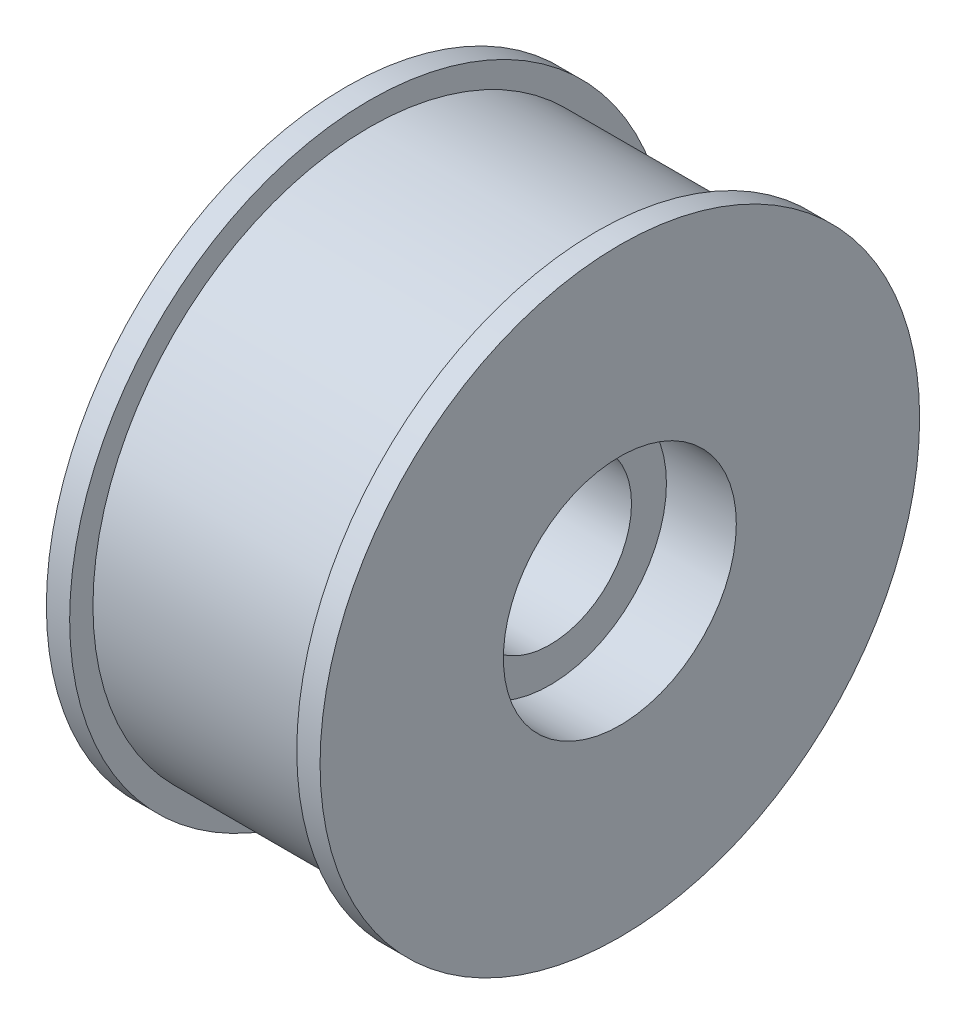
ISO-10303-21;
HEADER;
FILE_DESCRIPTION(('STEP AP214'),'2;1');
FILE_NAME('part.step','',(''),(''),'','','');
FILE_SCHEMA(('AUTOMOTIVE_DESIGN { 1 0 10303 214 1 1 1 1 }'));
ENDSEC;
DATA;
#1=APPLICATION_CONTEXT('core data for automotive mechanical design processes');
#2=APPLICATION_PROTOCOL_DEFINITION('international standard','automotive_design',2000,#1);
#3=PRODUCT_CONTEXT('',#1,'mechanical');
#4=PRODUCT('Part','Part','',(#3));
#5=PRODUCT_RELATED_PRODUCT_CATEGORY('part','',(#4));
#6=PRODUCT_DEFINITION_FORMATION('','',#4);
#7=PRODUCT_DEFINITION_CONTEXT('part definition',#1,'design');
#8=PRODUCT_DEFINITION('design','',#6,#7);
#9=PRODUCT_DEFINITION_SHAPE('','',#8);
#10=(LENGTH_UNIT() NAMED_UNIT(*) SI_UNIT(.MILLI.,.METRE.));
#11=(NAMED_UNIT(*) PLANE_ANGLE_UNIT() SI_UNIT($,.RADIAN.));
#12=(NAMED_UNIT(*) SI_UNIT($,.STERADIAN.) SOLID_ANGLE_UNIT());
#13=UNCERTAINTY_MEASURE_WITH_UNIT(LENGTH_MEASURE(1.E-05),#10,'distance_accuracy_value','');
#14=(GEOMETRIC_REPRESENTATION_CONTEXT(3) GLOBAL_UNCERTAINTY_ASSIGNED_CONTEXT((#13)) GLOBAL_UNIT_ASSIGNED_CONTEXT((#10,
#11,#12)) REPRESENTATION_CONTEXT('',''));
#15=CARTESIAN_POINT('',(0.,0.,0.));
#16=DIRECTION('',(0.,0.,1.));
#17=DIRECTION('',(1.,0.,0.));
#18=AXIS2_PLACEMENT_3D('',#15,#16,#17);
#19=CARTESIAN_POINT('',(0.,0.,0.));
#20=DIRECTION('',(-1.,0.,0.));
#21=DIRECTION('',(0.,-1.,0.));
#22=AXIS2_PLACEMENT_3D('',#19,#20,#21);
#23=PLANE('',#22);
#24=CARTESIAN_POINT('',(0.,0.,0.));
#25=DIRECTION('',(-1.,0.,0.));
#26=DIRECTION('',(0.,0.,1.));
#27=AXIS2_PLACEMENT_3D('',#24,#25,#26);
#28=CIRCLE('',#27,5.);
#29=CARTESIAN_POINT('',(0.,0.,5.));
#30=VERTEX_POINT('',#29);
#31=EDGE_CURVE('E65',#30,#30,#28,.T.);
#32=ORIENTED_EDGE('',*,*,#31,.F.);
#33=EDGE_LOOP('',(#32));
#34=FACE_BOUND('',#33,.T.);
#35=CARTESIAN_POINT('',(0.,0.,0.));
#36=DIRECTION('',(1.,0.,0.));
#37=DIRECTION('',(0.,1.,0.));
#38=AXIS2_PLACEMENT_3D('',#35,#36,#37);
#39=CIRCLE('',#38,12.87);
#40=CARTESIAN_POINT('',(0.,12.87,0.));
#41=VERTEX_POINT('',#40);
#42=EDGE_CURVE('E10',#41,#41,#39,.T.);
#43=ORIENTED_EDGE('',*,*,#42,.F.);
#44=EDGE_LOOP('',(#43));
#45=FACE_BOUND('',#44,.T.);
#46=ADVANCED_FACE('F33',(#34,#45),#23,.T.);
#47=CARTESIAN_POINT('',(11.75,0.,0.));
#48=DIRECTION('',(1.,0.,0.));
#49=DIRECTION('',(0.,1.,0.));
#50=AXIS2_PLACEMENT_3D('',#47,#48,#49);
#51=CYLINDRICAL_SURFACE('',#50,12.87);
#52=ORIENTED_EDGE('',*,*,#42,.T.);
#53=EDGE_LOOP('',(#52));
#54=FACE_BOUND('',#53,.T.);
#55=CARTESIAN_POINT('',(1.,0.,0.));
#56=DIRECTION('',(1.,0.,0.));
#57=DIRECTION('',(0.,1.,0.));
#58=AXIS2_PLACEMENT_3D('',#55,#56,#57);
#59=CIRCLE('',#58,12.87);
#60=CARTESIAN_POINT('',(1.,12.87,0.));
#61=VERTEX_POINT('',#60);
#62=EDGE_CURVE('E40',#61,#61,#59,.T.);
#63=ORIENTED_EDGE('',*,*,#62,.F.);
#64=EDGE_LOOP('',(#63));
#65=FACE_BOUND('',#64,.T.);
#66=ADVANCED_FACE('F94',(#54,#65),#51,.T.);
#67=CARTESIAN_POINT('',(1.,12.87,0.));
#68=DIRECTION('',(1.,0.,0.));
#69=DIRECTION('',(0.,1.,0.));
#70=AXIS2_PLACEMENT_3D('',#67,#68,#69);
#71=PLANE('',#70);
#72=ORIENTED_EDGE('',*,*,#62,.T.);
#73=EDGE_LOOP('',(#72));
#74=FACE_BOUND('',#73,.T.);
#75=CARTESIAN_POINT('',(1.,0.,0.));
#76=DIRECTION('',(1.,0.,0.));
#77=DIRECTION('',(0.,1.,0.));
#78=AXIS2_PLACEMENT_3D('',#75,#76,#77);
#79=CIRCLE('',#78,11.87);
#80=CARTESIAN_POINT('',(1.,11.87,0.));
#81=VERTEX_POINT('',#80);
#82=EDGE_CURVE('E44',#81,#81,#79,.T.);
#83=ORIENTED_EDGE('',*,*,#82,.F.);
#84=EDGE_LOOP('',(#83));
#85=FACE_BOUND('',#84,.T.);
#86=ADVANCED_FACE('F98',(#74,#85),#71,.T.);
#87=CARTESIAN_POINT('',(11.75,0.,0.));
#88=DIRECTION('',(1.,0.,0.));
#89=DIRECTION('',(0.,1.,0.));
#90=AXIS2_PLACEMENT_3D('',#87,#88,#89);
#91=CYLINDRICAL_SURFACE('',#90,11.87);
#92=ORIENTED_EDGE('',*,*,#82,.T.);
#93=EDGE_LOOP('',(#92));
#94=FACE_BOUND('',#93,.T.);
#95=CARTESIAN_POINT('',(10.75,0.,0.));
#96=DIRECTION('',(1.,0.,0.));
#97=DIRECTION('',(0.,1.,0.));
#98=AXIS2_PLACEMENT_3D('',#95,#96,#97);
#99=CIRCLE('',#98,11.87);
#100=CARTESIAN_POINT('',(10.75,11.87,0.));
#101=VERTEX_POINT('',#100);
#102=EDGE_CURVE('E49',#101,#101,#99,.T.);
#103=ORIENTED_EDGE('',*,*,#102,.F.);
#104=EDGE_LOOP('',(#103));
#105=FACE_BOUND('',#104,.T.);
#106=ADVANCED_FACE('F102',(#94,#105),#91,.T.);
#107=CARTESIAN_POINT('',(10.75,11.87,0.));
#108=DIRECTION('',(-1.,0.,0.));
#109=DIRECTION('',(0.,-1.,0.));
#110=AXIS2_PLACEMENT_3D('',#107,#108,#109);
#111=PLANE('',#110);
#112=ORIENTED_EDGE('',*,*,#102,.T.);
#113=EDGE_LOOP('',(#112));
#114=FACE_BOUND('',#113,.T.);
#115=CARTESIAN_POINT('',(10.75,0.,0.));
#116=DIRECTION('',(1.,0.,0.));
#117=DIRECTION('',(0.,1.,0.));
#118=AXIS2_PLACEMENT_3D('',#115,#116,#117);
#119=CIRCLE('',#118,12.87);
#120=CARTESIAN_POINT('',(10.75,12.87,0.));
#121=VERTEX_POINT('',#120);
#122=EDGE_CURVE('E52',#121,#121,#119,.T.);
#123=ORIENTED_EDGE('',*,*,#122,.F.);
#124=EDGE_LOOP('',(#123));
#125=FACE_BOUND('',#124,.T.);
#126=ADVANCED_FACE('F109',(#114,#125),#111,.T.);
#127=CARTESIAN_POINT('',(11.75,0.,0.));
#128=DIRECTION('',(1.,0.,0.));
#129=DIRECTION('',(0.,1.,0.));
#130=AXIS2_PLACEMENT_3D('',#127,#128,#129);
#131=CYLINDRICAL_SURFACE('',#130,12.87);
#132=ORIENTED_EDGE('',*,*,#122,.T.);
#133=EDGE_LOOP('',(#132));
#134=FACE_BOUND('',#133,.T.);
#135=CARTESIAN_POINT('',(11.75,0.,0.));
#136=DIRECTION('',(1.,0.,0.));
#137=DIRECTION('',(0.,1.,0.));
#138=AXIS2_PLACEMENT_3D('',#135,#136,#137);
#139=CIRCLE('',#138,12.87);
#140=CARTESIAN_POINT('',(11.75,12.87,0.));
#141=VERTEX_POINT('',#140);
#142=EDGE_CURVE('E55',#141,#141,#139,.T.);
#143=ORIENTED_EDGE('',*,*,#142,.F.);
#144=EDGE_LOOP('',(#143));
#145=FACE_BOUND('',#144,.T.);
#146=ADVANCED_FACE('F113',(#134,#145),#131,.T.);
#147=CARTESIAN_POINT('',(11.75,12.87,0.));
#148=DIRECTION('',(1.,0.,0.));
#149=DIRECTION('',(0.,1.,0.));
#150=AXIS2_PLACEMENT_3D('',#147,#148,#149);
#151=PLANE('',#150);
#152=CARTESIAN_POINT('',(11.75,0.,0.));
#153=DIRECTION('',(1.,0.,0.));
#154=DIRECTION('',(0.,0.,-1.));
#155=AXIS2_PLACEMENT_3D('',#152,#153,#154);
#156=CIRCLE('',#155,5.);
#157=CARTESIAN_POINT('',(11.75,0.,-5.));
#158=VERTEX_POINT('',#157);
#159=EDGE_CURVE('E59',#158,#158,#156,.T.);
#160=ORIENTED_EDGE('',*,*,#159,.F.);
#161=EDGE_LOOP('',(#160));
#162=FACE_BOUND('',#161,.T.);
#163=ORIENTED_EDGE('',*,*,#142,.T.);
#164=EDGE_LOOP('',(#163));
#165=FACE_BOUND('',#164,.T.);
#166=ADVANCED_FACE('F117',(#162,#165),#151,.T.);
#167=CARTESIAN_POINT('',(8.75,0.,0.));
#168=DIRECTION('',(1.,0.,0.));
#169=DIRECTION('',(0.,0.,-1.));
#170=AXIS2_PLACEMENT_3D('',#167,#168,#169);
#171=CYLINDRICAL_SURFACE('',#170,5.);
#172=CARTESIAN_POINT('',(8.75,0.,0.));
#173=DIRECTION('',(1.,0.,0.));
#174=DIRECTION('',(0.,0.,-1.));
#175=AXIS2_PLACEMENT_3D('',#172,#173,#174);
#176=CIRCLE('',#175,5.);
#177=CARTESIAN_POINT('',(8.75,0.,-5.));
#178=VERTEX_POINT('',#177);
#179=EDGE_CURVE('E58',#178,#178,#176,.T.);
#180=ORIENTED_EDGE('',*,*,#179,.F.);
#181=EDGE_LOOP('',(#180));
#182=FACE_BOUND('',#181,.T.);
#183=ORIENTED_EDGE('',*,*,#159,.T.);
#184=EDGE_LOOP('',(#183));
#185=FACE_BOUND('',#184,.T.);
#186=ADVANCED_FACE('F121',(#182,#185),#171,.F.);
#187=CARTESIAN_POINT('',(8.75,0.,0.));
#188=DIRECTION('',(1.,0.,0.));
#189=DIRECTION('',(0.,0.,-1.));
#190=AXIS2_PLACEMENT_3D('',#187,#188,#189);
#191=PLANE('',#190);
#192=CARTESIAN_POINT('',(8.75,0.,0.));
#193=DIRECTION('',(1.,0.,0.));
#194=DIRECTION('',(0.,0.,-1.));
#195=AXIS2_PLACEMENT_3D('',#192,#193,#194);
#196=CIRCLE('',#195,3.5);
#197=CARTESIAN_POINT('',(8.75,0.,-3.5));
#198=VERTEX_POINT('',#197);
#199=EDGE_CURVE('E70',#198,#198,#196,.T.);
#200=ORIENTED_EDGE('',*,*,#199,.F.);
#201=EDGE_LOOP('',(#200));
#202=FACE_BOUND('',#201,.T.);
#203=ORIENTED_EDGE('',*,*,#179,.T.);
#204=EDGE_LOOP('',(#203));
#205=FACE_BOUND('',#204,.T.);
#206=ADVANCED_FACE('F88',(#202,#205),#191,.T.);
#207=CARTESIAN_POINT('',(3.,0.,0.));
#208=DIRECTION('',(-1.,0.,0.));
#209=DIRECTION('',(0.,0.,1.));
#210=AXIS2_PLACEMENT_3D('',#207,#208,#209);
#211=CYLINDRICAL_SURFACE('',#210,5.);
#212=CARTESIAN_POINT('',(3.,0.,0.));
#213=DIRECTION('',(-1.,0.,0.));
#214=DIRECTION('',(0.,0.,1.));
#215=AXIS2_PLACEMENT_3D('',#212,#213,#214);
#216=CIRCLE('',#215,5.);
#217=CARTESIAN_POINT('',(3.,0.,5.));
#218=VERTEX_POINT('',#217);
#219=EDGE_CURVE('E62',#218,#218,#216,.T.);
#220=ORIENTED_EDGE('',*,*,#219,.F.);
#221=EDGE_LOOP('',(#220));
#222=FACE_BOUND('',#221,.T.);
#223=ORIENTED_EDGE('',*,*,#31,.T.);
#224=EDGE_LOOP('',(#223));
#225=FACE_BOUND('',#224,.T.);
#226=ADVANCED_FACE('F82',(#222,#225),#211,.F.);
#227=CARTESIAN_POINT('',(3.,0.,0.));
#228=DIRECTION('',(-1.,0.,0.));
#229=DIRECTION('',(0.,0.,1.));
#230=AXIS2_PLACEMENT_3D('',#227,#228,#229);
#231=PLANE('',#230);
#232=CARTESIAN_POINT('',(3.,0.,0.));
#233=DIRECTION('',(-1.,0.,0.));
#234=DIRECTION('',(0.,0.,1.));
#235=AXIS2_PLACEMENT_3D('',#232,#233,#234);
#236=CIRCLE('',#235,3.5);
#237=CARTESIAN_POINT('',(3.,0.,3.5));
#238=VERTEX_POINT('',#237);
#239=EDGE_CURVE('E36',#238,#238,#236,.T.);
#240=ORIENTED_EDGE('',*,*,#239,.F.);
#241=EDGE_LOOP('',(#240));
#242=FACE_BOUND('',#241,.T.);
#243=ORIENTED_EDGE('',*,*,#219,.T.);
#244=EDGE_LOOP('',(#243));
#245=FACE_BOUND('',#244,.T.);
#246=ADVANCED_FACE('F79',(#242,#245),#231,.T.);
#247=CARTESIAN_POINT('',(0.,0.,0.));
#248=DIRECTION('',(1.,0.,0.));
#249=DIRECTION('',(0.,0.,-1.));
#250=AXIS2_PLACEMENT_3D('',#247,#248,#249);
#251=CYLINDRICAL_SURFACE('',#250,3.5);
#252=ORIENTED_EDGE('',*,*,#239,.T.);
#253=EDGE_LOOP('',(#252));
#254=FACE_BOUND('',#253,.T.);
#255=ORIENTED_EDGE('',*,*,#199,.T.);
#256=EDGE_LOOP('',(#255));
#257=FACE_BOUND('',#256,.T.);
#258=ADVANCED_FACE('F77',(#254,#257),#251,.F.);
#259=CLOSED_SHELL('',(#46,#66,#86,#106,#126,#146,#166,#186,#206,#226,#246,#258));
#260=MANIFOLD_SOLID_BREP('B2',#259);
#261=ADVANCED_BREP_SHAPE_REPRESENTATION('',(#18,#260),#14);
#262=SHAPE_DEFINITION_REPRESENTATION(#9,#261);
ENDSEC;
END-ISO-10303-21;
